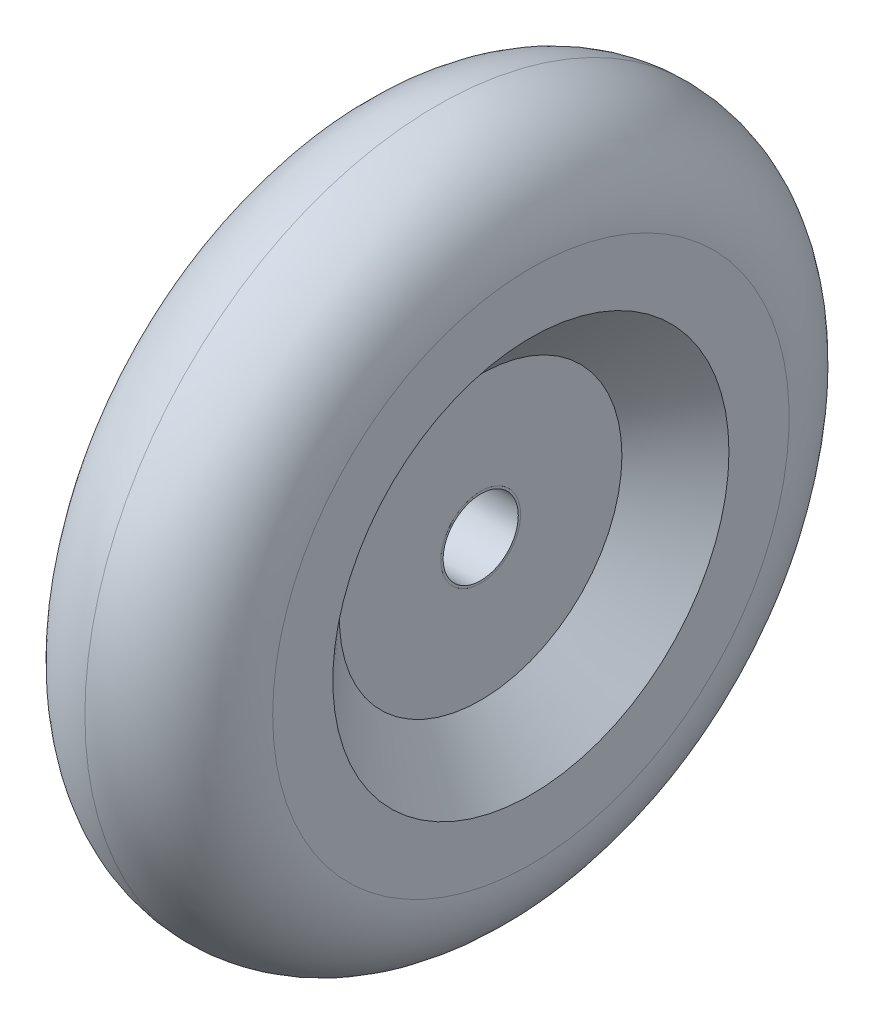
ISO-10303-21;
HEADER;
FILE_DESCRIPTION(('STEP AP214'),'2;1');
FILE_NAME('part.step','',(''),(''),'','','');
FILE_SCHEMA(('AUTOMOTIVE_DESIGN { 1 0 10303 214 1 1 1 1 }'));
ENDSEC;
DATA;
#1=APPLICATION_CONTEXT('core data for automotive mechanical design processes');
#2=APPLICATION_PROTOCOL_DEFINITION('international standard','automotive_design',2000,#1);
#3=PRODUCT_CONTEXT('',#1,'mechanical');
#4=PRODUCT('Part','Part','',(#3));
#5=PRODUCT_RELATED_PRODUCT_CATEGORY('part','',(#4));
#6=PRODUCT_DEFINITION_FORMATION('','',#4);
#7=PRODUCT_DEFINITION_CONTEXT('part definition',#1,'design');
#8=PRODUCT_DEFINITION('design','',#6,#7);
#9=PRODUCT_DEFINITION_SHAPE('','',#8);
#10=(LENGTH_UNIT() NAMED_UNIT(*) SI_UNIT(.MILLI.,.METRE.));
#11=(NAMED_UNIT(*) PLANE_ANGLE_UNIT() SI_UNIT($,.RADIAN.));
#12=(NAMED_UNIT(*) SI_UNIT($,.STERADIAN.) SOLID_ANGLE_UNIT());
#13=UNCERTAINTY_MEASURE_WITH_UNIT(LENGTH_MEASURE(1.E-05),#10,'distance_accuracy_value','');
#14=(GEOMETRIC_REPRESENTATION_CONTEXT(3) GLOBAL_UNCERTAINTY_ASSIGNED_CONTEXT((#13)) GLOBAL_UNIT_ASSIGNED_CONTEXT((#10,
#11,#12)) REPRESENTATION_CONTEXT('',''));
#15=CARTESIAN_POINT('',(0.,0.,0.));
#16=DIRECTION('',(0.,0.,1.));
#17=DIRECTION('',(1.,0.,0.));
#18=AXIS2_PLACEMENT_3D('',#15,#16,#17);
#19=CARTESIAN_POINT('',(226.798142907966,-224.387010818881,-45.));
#20=DIRECTION('',(-1.,0.,0.));
#21=DIRECTION('',(0.,0.,1.));
#22=AXIS2_PLACEMENT_3D('',#19,#20,#21);
#23=CYLINDRICAL_SURFACE('',#22,4.24096034081595);
#24=CARTESIAN_POINT('',(216.793300195848,-224.387010818881,-45.));
#25=DIRECTION('',(-1.,0.,0.));
#26=DIRECTION('',(0.,0.,1.));
#27=AXIS2_PLACEMENT_3D('',#24,#25,#26);
#28=CIRCLE('',#27,4.24096034081595);
#29=CARTESIAN_POINT('',(216.793300195848,-224.387010818881,-40.7590396591841));
#30=VERTEX_POINT('',#29);
#31=EDGE_CURVE('E83',#30,#30,#28,.T.);
#32=ORIENTED_EDGE('',*,*,#31,.F.);
#33=EDGE_LOOP('',(#32));
#34=FACE_BOUND('',#33,.T.);
#35=CARTESIAN_POINT('',(216.798142907966,-224.387010818881,-45.));
#36=DIRECTION('',(1.,0.,0.));
#37=DIRECTION('',(0.,0.,-1.));
#38=AXIS2_PLACEMENT_3D('',#35,#36,#37);
#39=CIRCLE('',#38,4.24096034081595);
#40=CARTESIAN_POINT('',(216.798142907966,-224.387010818881,-49.2409603408159));
#41=VERTEX_POINT('',#40);
#42=EDGE_CURVE('E87',#41,#41,#39,.T.);
#43=ORIENTED_EDGE('',*,*,#42,.F.);
#44=EDGE_LOOP('',(#43));
#45=FACE_BOUND('',#44,.T.);
#46=ADVANCED_FACE('F51',(#34,#45),#23,.T.);
#47=CARTESIAN_POINT('',(207.268142907966,-220.146050478065,-45.));
#48=DIRECTION('',(1.,0.,0.));
#49=DIRECTION('',(0.,0.,-1.));
#50=AXIS2_PLACEMENT_3D('',#47,#48,#49);
#51=PLANE('',#50);
#52=CARTESIAN_POINT('',(207.268142907966,-224.387010818881,-45.));
#53=DIRECTION('',(1.,0.,0.));
#54=DIRECTION('',(0.,0.,-1.));
#55=AXIS2_PLACEMENT_3D('',#52,#53,#54);
#56=CIRCLE('',#55,4.00000000000001);
#57=CARTESIAN_POINT('',(207.268142907966,-224.387010818881,-49.));
#58=VERTEX_POINT('',#57);
#59=EDGE_CURVE('E91',#58,#58,#56,.T.);
#60=ORIENTED_EDGE('',*,*,#59,.T.);
#61=EDGE_LOOP('',(#60));
#62=FACE_BOUND('',#61,.T.);
#63=CARTESIAN_POINT('',(207.268142907966,-224.387010818881,-45.));
#64=DIRECTION('',(1.,0.,0.));
#65=DIRECTION('',(0.,0.,-1.));
#66=AXIS2_PLACEMENT_3D('',#63,#64,#65);
#67=CIRCLE('',#66,14.5422249917012);
#68=CARTESIAN_POINT('',(207.268142907966,-224.387010818881,-59.5422249917012));
#69=VERTEX_POINT('',#68);
#70=EDGE_CURVE('E65',#69,#69,#67,.T.);
#71=ORIENTED_EDGE('',*,*,#70,.F.);
#72=EDGE_LOOP('',(#71));
#73=FACE_BOUND('',#72,.T.);
#74=ADVANCED_FACE('F111',(#62,#73),#51,.F.);
#75=CARTESIAN_POINT('',(207.268142907966,-224.387010818881,-45.));
#76=DIRECTION('',(-1.,0.,0.));
#77=DIRECTION('',(0.,0.,1.));
#78=AXIS2_PLACEMENT_3D('',#75,#76,#77);
#79=CONICAL_SURFACE('',#78,14.5422249917012,0.723851281054418);
#80=CARTESIAN_POINT('',(202.142042365197,-224.387010818881,-45.));
#81=DIRECTION('',(1.,0.,0.));
#82=DIRECTION('',(0.,0.,-1.));
#83=AXIS2_PLACEMENT_3D('',#80,#81,#82);
#84=CIRCLE('',#83,19.0732103774336);
#85=CARTESIAN_POINT('',(202.142042365197,-224.387010818881,-64.0732103774336));
#86=VERTEX_POINT('',#85);
#87=EDGE_CURVE('E71',#86,#86,#84,.T.);
#88=ORIENTED_EDGE('',*,*,#87,.F.);
#89=EDGE_LOOP('',(#88));
#90=FACE_BOUND('',#89,.T.);
#91=ORIENTED_EDGE('',*,*,#70,.T.);
#92=EDGE_LOOP('',(#91));
#93=FACE_BOUND('',#92,.T.);
#94=ADVANCED_FACE('F118',(#90,#93),#79,.F.);
#95=CARTESIAN_POINT('',(202.142042365197,-205.313800441447,-45.));
#96=DIRECTION('',(1.,0.,0.));
#97=DIRECTION('',(0.,0.,-1.));
#98=AXIS2_PLACEMENT_3D('',#95,#96,#97);
#99=PLANE('',#98);
#100=CARTESIAN_POINT('',(202.142042365197,-224.387010818881,-45.));
#101=DIRECTION('',(1.,0.,0.));
#102=DIRECTION('',(0.,0.,-1.));
#103=AXIS2_PLACEMENT_3D('',#100,#101,#102);
#104=CIRCLE('',#103,27.5);
#105=CARTESIAN_POINT('',(202.142042365197,-224.387010818881,-72.5));
#106=VERTEX_POINT('',#105);
#107=EDGE_CURVE('E60',#106,#106,#104,.F.);
#108=ORIENTED_EDGE('',*,*,#107,.T.);
#109=EDGE_LOOP('',(#108));
#110=FACE_BOUND('',#109,.T.);
#111=ORIENTED_EDGE('',*,*,#87,.T.);
#112=EDGE_LOOP('',(#111));
#113=FACE_BOUND('',#112,.T.);
#114=ADVANCED_FACE('F134',(#110,#113),#99,.F.);
#115=CARTESIAN_POINT('',(222.142042365197,-186.887010818881,-45.));
#116=DIRECTION('',(-1.,0.,0.));
#117=DIRECTION('',(0.,0.,1.));
#118=AXIS2_PLACEMENT_3D('',#115,#116,#117);
#119=PLANE('',#118);
#120=CARTESIAN_POINT('',(222.142042365197,-224.387010818881,-45.));
#121=DIRECTION('',(-1.,0.,0.));
#122=DIRECTION('',(0.,0.,1.));
#123=AXIS2_PLACEMENT_3D('',#120,#121,#122);
#124=CIRCLE('',#123,27.5);
#125=CARTESIAN_POINT('',(222.142042365197,-224.387010818881,-17.5));
#126=VERTEX_POINT('',#125);
#127=EDGE_CURVE('E10',#126,#126,#124,.F.);
#128=ORIENTED_EDGE('',*,*,#127,.T.);
#129=EDGE_LOOP('',(#128));
#130=FACE_BOUND('',#129,.T.);
#131=CARTESIAN_POINT('',(222.142042365197,-224.387010818881,-45.));
#132=DIRECTION('',(1.,0.,0.));
#133=DIRECTION('',(0.,0.,-1.));
#134=AXIS2_PLACEMENT_3D('',#131,#132,#133);
#135=CIRCLE('',#134,21.0934892980855);
#136=CARTESIAN_POINT('',(222.142042365197,-224.387010818881,-66.0934892980855));
#137=VERTEX_POINT('',#136);
#138=EDGE_CURVE('E75',#137,#137,#135,.T.);
#139=ORIENTED_EDGE('',*,*,#138,.F.);
#140=EDGE_LOOP('',(#139));
#141=FACE_BOUND('',#140,.T.);
#142=ADVANCED_FACE('F130',(#130,#141),#119,.F.);
#143=CARTESIAN_POINT('',(222.142042365197,-224.387010818881,-45.));
#144=DIRECTION('',(1.,0.,0.));
#145=DIRECTION('',(0.,0.,-1.));
#146=AXIS2_PLACEMENT_3D('',#143,#144,#145);
#147=CONICAL_SURFACE('',#146,21.0934892980855,0.846945045740481);
#148=CARTESIAN_POINT('',(216.793300195848,-224.387010818881,-45.));
#149=DIRECTION('',(1.,0.,0.));
#150=DIRECTION('',(0.,0.,-1.));
#151=AXIS2_PLACEMENT_3D('',#148,#149,#150);
#152=CIRCLE('',#151,15.0422249917012);
#153=CARTESIAN_POINT('',(216.793300195848,-224.387010818881,-60.0422249917012));
#154=VERTEX_POINT('',#153);
#155=EDGE_CURVE('E79',#154,#154,#152,.T.);
#156=ORIENTED_EDGE('',*,*,#155,.F.);
#157=EDGE_LOOP('',(#156));
#158=FACE_BOUND('',#157,.T.);
#159=ORIENTED_EDGE('',*,*,#138,.T.);
#160=EDGE_LOOP('',(#159));
#161=FACE_BOUND('',#160,.T.);
#162=ADVANCED_FACE('F126',(#158,#161),#147,.F.);
#163=CARTESIAN_POINT('',(216.793300195848,-209.34478582718,-45.));
#164=DIRECTION('',(-1.,0.,0.));
#165=DIRECTION('',(0.,0.,1.));
#166=AXIS2_PLACEMENT_3D('',#163,#164,#165);
#167=PLANE('',#166);
#168=ORIENTED_EDGE('',*,*,#31,.T.);
#169=EDGE_LOOP('',(#168));
#170=FACE_BOUND('',#169,.T.);
#171=ORIENTED_EDGE('',*,*,#155,.T.);
#172=EDGE_LOOP('',(#171));
#173=FACE_BOUND('',#172,.T.);
#174=ADVANCED_FACE('F124',(#170,#173),#167,.F.);
#175=CARTESIAN_POINT('',(212.142042365197,-224.387010818881,-45.));
#176=DIRECTION('',(-1.,0.,0.));
#177=DIRECTION('',(0.,0.,1.));
#178=AXIS2_PLACEMENT_3D('',#175,#176,#177);
#179=TOROIDAL_SURFACE('',#178,27.5,10.);
#180=ORIENTED_EDGE('',*,*,#127,.F.);
#181=EDGE_LOOP('',(#180));
#182=FACE_BOUND('',#181,.T.);
#183=CARTESIAN_POINT('',(212.142042365197,-224.387010818881,-45.));
#184=DIRECTION('',(-1.,0.,0.));
#185=DIRECTION('',(0.,0.,1.));
#186=AXIS2_PLACEMENT_3D('',#183,#184,#185);
#187=CIRCLE('',#186,37.5);
#188=CARTESIAN_POINT('',(212.142042365197,-224.387010818881,-7.49999999999999));
#189=VERTEX_POINT('',#188);
#190=EDGE_CURVE('E55',#189,#189,#187,.T.);
#191=ORIENTED_EDGE('',*,*,#190,.F.);
#192=EDGE_LOOP('',(#191));
#193=FACE_BOUND('',#192,.T.);
#194=ADVANCED_FACE('F53',(#182,#193),#179,.T.);
#195=CARTESIAN_POINT('',(212.142042365197,-224.387010818881,-45.));
#196=DIRECTION('',(1.,0.,0.));
#197=DIRECTION('',(0.,0.,-1.));
#198=AXIS2_PLACEMENT_3D('',#195,#196,#197);
#199=TOROIDAL_SURFACE('',#198,27.5,10.);
#200=ORIENTED_EDGE('',*,*,#107,.F.);
#201=EDGE_LOOP('',(#200));
#202=FACE_BOUND('',#201,.T.);
#203=ORIENTED_EDGE('',*,*,#190,.T.);
#204=EDGE_LOOP('',(#203));
#205=FACE_BOUND('',#204,.T.);
#206=ADVANCED_FACE('F106',(#202,#205),#199,.T.);
#207=CARTESIAN_POINT('',(216.798142907966,-224.387010818881,-45.));
#208=DIRECTION('',(1.,0.,0.));
#209=DIRECTION('',(0.,0.,-1.));
#210=AXIS2_PLACEMENT_3D('',#207,#208,#209);
#211=PLANE('',#210);
#212=CARTESIAN_POINT('',(216.798142907966,-224.387010818881,-45.));
#213=DIRECTION('',(1.,0.,0.));
#214=DIRECTION('',(0.,0.,-1.));
#215=AXIS2_PLACEMENT_3D('',#212,#213,#214);
#216=CIRCLE('',#215,4.00000000000001);
#217=CARTESIAN_POINT('',(216.798142907966,-224.387010818881,-49.));
#218=VERTEX_POINT('',#217);
#219=EDGE_CURVE('E95',#218,#218,#216,.T.);
#220=ORIENTED_EDGE('',*,*,#219,.F.);
#221=EDGE_LOOP('',(#220));
#222=FACE_BOUND('',#221,.T.);
#223=ORIENTED_EDGE('',*,*,#42,.T.);
#224=EDGE_LOOP('',(#223));
#225=FACE_BOUND('',#224,.T.);
#226=ADVANCED_FACE('F103',(#222,#225),#211,.T.);
#227=CARTESIAN_POINT('',(201.798142907966,-224.387010818881,-45.));
#228=DIRECTION('',(1.,0.,0.));
#229=DIRECTION('',(0.,0.,-1.));
#230=AXIS2_PLACEMENT_3D('',#227,#228,#229);
#231=CYLINDRICAL_SURFACE('',#230,4.00000000000001);
#232=ORIENTED_EDGE('',*,*,#219,.T.);
#233=EDGE_LOOP('',(#232));
#234=FACE_BOUND('',#233,.T.);
#235=ORIENTED_EDGE('',*,*,#59,.F.);
#236=EDGE_LOOP('',(#235));
#237=FACE_BOUND('',#236,.T.);
#238=ADVANCED_FACE('F100',(#234,#237),#231,.F.);
#239=CLOSED_SHELL('',(#46,#74,#94,#114,#142,#162,#174,#194,#206,#226,#238));
#240=MANIFOLD_SOLID_BREP('B2',#239);
#241=ADVANCED_BREP_SHAPE_REPRESENTATION('',(#18,#240),#14);
#242=SHAPE_DEFINITION_REPRESENTATION(#9,#241);
ENDSEC;
END-ISO-10303-21;
